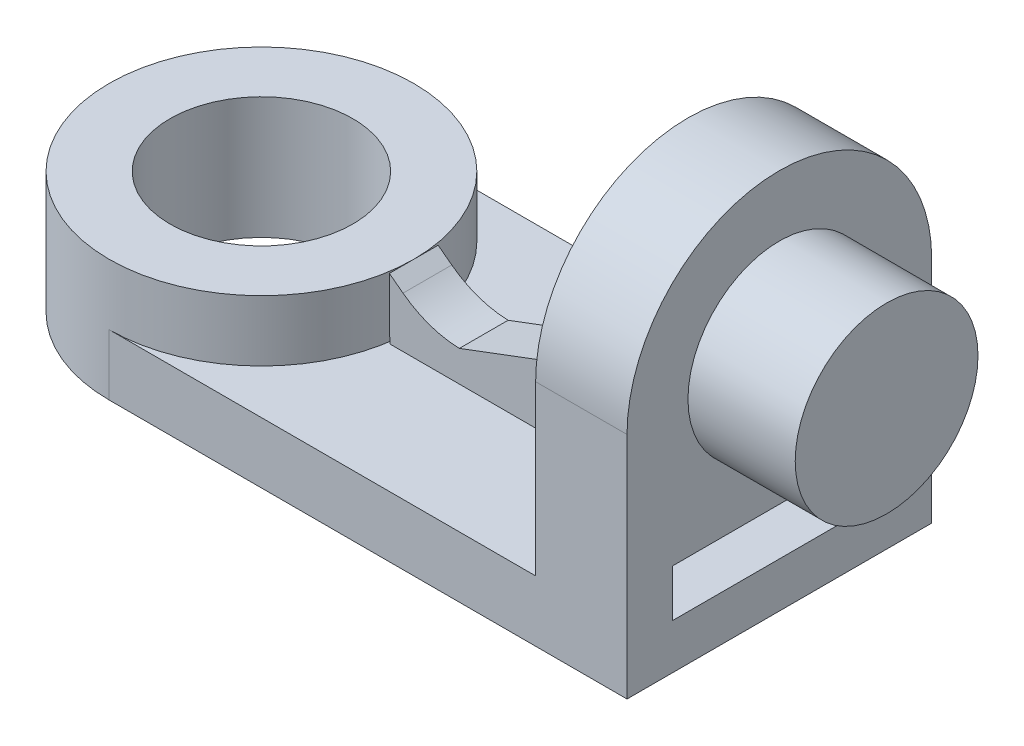
ISO-10303-21;
HEADER;
FILE_DESCRIPTION(('STEP AP214'),'2;1');
FILE_NAME('part.step','',(''),(''),'','','');
FILE_SCHEMA(('AUTOMOTIVE_DESIGN { 1 0 10303 214 1 1 1 1 }'));
ENDSEC;
DATA;
#1=APPLICATION_CONTEXT('core data for automotive mechanical design processes');
#2=APPLICATION_PROTOCOL_DEFINITION('international standard','automotive_design',2000,#1);
#3=PRODUCT_CONTEXT('',#1,'mechanical');
#4=PRODUCT('Part','Part','',(#3));
#5=PRODUCT_RELATED_PRODUCT_CATEGORY('part','',(#4));
#6=PRODUCT_DEFINITION_FORMATION('','',#4);
#7=PRODUCT_DEFINITION_CONTEXT('part definition',#1,'design');
#8=PRODUCT_DEFINITION('design','',#6,#7);
#9=PRODUCT_DEFINITION_SHAPE('','',#8);
#10=(LENGTH_UNIT() NAMED_UNIT(*) SI_UNIT(.MILLI.,.METRE.));
#11=(NAMED_UNIT(*) PLANE_ANGLE_UNIT() SI_UNIT($,.RADIAN.));
#12=(NAMED_UNIT(*) SI_UNIT($,.STERADIAN.) SOLID_ANGLE_UNIT());
#13=UNCERTAINTY_MEASURE_WITH_UNIT(LENGTH_MEASURE(1.E-05),#10,'distance_accuracy_value','');
#14=(GEOMETRIC_REPRESENTATION_CONTEXT(3) GLOBAL_UNCERTAINTY_ASSIGNED_CONTEXT((#13)) GLOBAL_UNIT_ASSIGNED_CONTEXT((#10,
#11,#12)) REPRESENTATION_CONTEXT('',''));
#15=CARTESIAN_POINT('',(0.,0.,0.));
#16=DIRECTION('',(0.,0.,1.));
#17=DIRECTION('',(1.,0.,0.));
#18=AXIS2_PLACEMENT_3D('',#15,#16,#17);
#19=CARTESIAN_POINT('',(0.,0.,13.335));
#20=DIRECTION('',(0.,0.,-1.));
#21=DIRECTION('',(-1.,0.,0.));
#22=AXIS2_PLACEMENT_3D('',#19,#20,#21);
#23=PLANE('',#22);
#24=DIRECTION('',(0.,1.,0.));
#25=VECTOR('',#24,1.);
#26=CARTESIAN_POINT('',(44.3323276109027,2.04732485996252,13.335));
#27=LINE('',#26,#25);
#28=CARTESIAN_POINT('',(44.3323276109027,2.04732485996252,13.335));
#29=VERTEX_POINT('',#28);
#30=CARTESIAN_POINT('',(44.3323276109027,17.5413248599625,13.335));
#31=VERTEX_POINT('',#30);
#32=EDGE_CURVE('E13',#29,#31,#27,.T.);
#33=ORIENTED_EDGE('',*,*,#32,.F.);
#34=DIRECTION('',(0.999929666975512,0.0118600633320941,0.));
#35=VECTOR('',#34,1.);
#36=CARTESIAN_POINT('',(15.9469883545853,1.71064925926635,13.335));
#37=LINE('',#36,#35);
#38=CARTESIAN_POINT('',(15.9469883545853,1.71064925926635,13.335));
#39=VERTEX_POINT('',#38);
#40=EDGE_CURVE('E59',#39,#29,#37,.T.);
#41=ORIENTED_EDGE('',*,*,#40,.F.);
#42=DIRECTION('',(0.00655059718679373,-0.999978544608081,0.));
#43=VECTOR('',#42,1.);
#44=CARTESIAN_POINT('',(15.875,12.7,13.335));
#45=LINE('',#44,#43);
#46=CARTESIAN_POINT('',(15.875,12.7,13.335));
#47=VERTEX_POINT('',#46);
#48=EDGE_CURVE('E137',#47,#39,#45,.T.);
#49=ORIENTED_EDGE('',*,*,#48,.F.);
#50=DIRECTION('',(-0.797948568980838,0.602725543893265,0.));
#51=VECTOR('',#50,1.);
#52=CARTESIAN_POINT('',(17.296678151654,11.6261441520081,13.335));
#53=LINE('',#52,#51);
#54=CARTESIAN_POINT('',(17.296678151654,11.6261441520081,13.335));
#55=VERTEX_POINT('',#54);
#56=EDGE_CURVE('E161',#55,#47,#53,.T.);
#57=ORIENTED_EDGE('',*,*,#56,.F.);
#58=CARTESIAN_POINT('',(23.4203696776096,19.7333016128534,13.335));
#59=DIRECTION('',(0.,0.,-1.));
#60=DIRECTION('',(-1.,0.,0.));
#61=AXIS2_PLACEMENT_3D('',#58,#59,#60);
#62=CIRCLE('',#61,10.16);
#63=CARTESIAN_POINT('',(23.1696247172813,9.576396229575,13.335));
#64=VERTEX_POINT('',#63);
#65=EDGE_CURVE('E152',#64,#55,#62,.T.);
#66=ORIENTED_EDGE('',*,*,#65,.F.);
#67=DIRECTION('',(-0.935908095158257,-0.352244286564372,0.));
#68=VECTOR('',#67,1.);
#69=CARTESIAN_POINT('',(44.3323276109027,17.5413248599625,13.335));
#70=LINE('',#69,#68);
#71=EDGE_CURVE('E100',#31,#64,#70,.T.);
#72=ORIENTED_EDGE('',*,*,#71,.F.);
#73=EDGE_LOOP('',(#33,#41,#49,#57,#66,#72));
#74=FACE_BOUND('',#73,.T.);
#75=ADVANCED_FACE('F43',(#74),#23,.T.);
#76=CARTESIAN_POINT('',(15.9469883545853,1.71064925926635,15.875));
#77=DIRECTION('',(-0.0118600633320941,0.999929666975512,0.));
#78=DIRECTION('',(-0.999929666975512,-0.0118600633320941,0.));
#79=AXIS2_PLACEMENT_3D('',#76,#77,#78);
#80=PLANE('',#79);
#81=ORIENTED_EDGE('',*,*,#40,.T.);
#82=DIRECTION('',(0.,0.,-1.));
#83=VECTOR('',#82,1.);
#84=CARTESIAN_POINT('',(44.3323276109027,2.04732485996252,15.875));
#85=LINE('',#84,#83);
#86=CARTESIAN_POINT('',(44.3323276109027,2.04732485996252,18.415));
#87=VERTEX_POINT('',#86);
#88=EDGE_CURVE('E135',#87,#29,#85,.T.);
#89=ORIENTED_EDGE('',*,*,#88,.F.);
#90=DIRECTION('',(0.999929666975512,0.0118600633320941,0.));
#91=VECTOR('',#90,1.);
#92=CARTESIAN_POINT('',(15.9469883545853,1.71064925926635,18.415));
#93=LINE('',#92,#91);
#94=CARTESIAN_POINT('',(15.9469883545853,1.71064925926635,18.415));
#95=VERTEX_POINT('',#94);
#96=EDGE_CURVE('E111',#95,#87,#93,.T.);
#97=ORIENTED_EDGE('',*,*,#96,.F.);
#98=DIRECTION('',(0.,0.,-1.));
#99=VECTOR('',#98,1.);
#100=CARTESIAN_POINT('',(15.9469883545853,1.71064925926635,15.875));
#101=LINE('',#100,#99);
#102=EDGE_CURVE('E138',#95,#39,#101,.T.);
#103=ORIENTED_EDGE('',*,*,#102,.T.);
#104=EDGE_LOOP('',(#81,#89,#97,#103));
#105=FACE_BOUND('',#104,.T.);
#106=ADVANCED_FACE('F174',(#105),#80,.F.);
#107=CARTESIAN_POINT('',(15.875,12.7,15.875));
#108=DIRECTION('',(0.999978544608081,0.00655059718679372,0.));
#109=DIRECTION('',(-0.00655059718679372,0.999978544608081,0.));
#110=AXIS2_PLACEMENT_3D('',#107,#108,#109);
#111=PLANE('',#110);
#112=ORIENTED_EDGE('',*,*,#48,.T.);
#113=ORIENTED_EDGE('',*,*,#102,.F.);
#114=DIRECTION('',(0.00655059718679373,-0.999978544608081,0.));
#115=VECTOR('',#114,1.);
#116=CARTESIAN_POINT('',(15.875,12.7,18.415));
#117=LINE('',#116,#115);
#118=CARTESIAN_POINT('',(15.875,12.7,18.415));
#119=VERTEX_POINT('',#118);
#120=EDGE_CURVE('E129',#119,#95,#117,.T.);
#121=ORIENTED_EDGE('',*,*,#120,.F.);
#122=DIRECTION('',(0.,0.,-1.));
#123=VECTOR('',#122,1.);
#124=CARTESIAN_POINT('',(15.875,12.7,15.875));
#125=LINE('',#124,#123);
#126=EDGE_CURVE('E165',#119,#47,#125,.T.);
#127=ORIENTED_EDGE('',*,*,#126,.T.);
#128=EDGE_LOOP('',(#112,#113,#121,#127));
#129=FACE_BOUND('',#128,.T.);
#130=ADVANCED_FACE('F186',(#129),#111,.F.);
#131=CARTESIAN_POINT('',(17.296678151654,11.6261441520081,15.875));
#132=DIRECTION('',(-0.602725543893265,-0.797948568980838,0.));
#133=DIRECTION('',(0.797948568980838,-0.602725543893265,0.));
#134=AXIS2_PLACEMENT_3D('',#131,#132,#133);
#135=PLANE('',#134);
#136=ORIENTED_EDGE('',*,*,#56,.T.);
#137=ORIENTED_EDGE('',*,*,#126,.F.);
#138=DIRECTION('',(-0.797948568980838,0.602725543893265,0.));
#139=VECTOR('',#138,1.);
#140=CARTESIAN_POINT('',(17.296678151654,11.6261441520081,18.415));
#141=LINE('',#140,#139);
#142=CARTESIAN_POINT('',(17.296678151654,11.6261441520081,18.415));
#143=VERTEX_POINT('',#142);
#144=EDGE_CURVE('E118',#143,#119,#141,.T.);
#145=ORIENTED_EDGE('',*,*,#144,.F.);
#146=DIRECTION('',(0.,0.,-1.));
#147=VECTOR('',#146,1.);
#148=CARTESIAN_POINT('',(17.296678151654,11.6261441520081,15.875));
#149=LINE('',#148,#147);
#150=EDGE_CURVE('E156',#143,#55,#149,.T.);
#151=ORIENTED_EDGE('',*,*,#150,.T.);
#152=EDGE_LOOP('',(#136,#137,#145,#151));
#153=FACE_BOUND('',#152,.T.);
#154=ADVANCED_FACE('F185',(#153),#135,.F.);
#155=CARTESIAN_POINT('',(23.4203696776096,19.7333016128534,15.875));
#156=DIRECTION('',(0.,0.,-1.));
#157=DIRECTION('',(-1.,0.,0.));
#158=AXIS2_PLACEMENT_3D('',#155,#156,#157);
#159=CYLINDRICAL_SURFACE('',#158,10.16);
#160=ORIENTED_EDGE('',*,*,#65,.T.);
#161=ORIENTED_EDGE('',*,*,#150,.F.);
#162=CARTESIAN_POINT('',(23.4203696776096,19.7333016128534,18.415));
#163=DIRECTION('',(0.,0.,-1.));
#164=DIRECTION('',(-1.,0.,0.));
#165=AXIS2_PLACEMENT_3D('',#162,#163,#164);
#166=CIRCLE('',#165,10.16);
#167=CARTESIAN_POINT('',(23.1696247172813,9.576396229575,18.415));
#168=VERTEX_POINT('',#167);
#169=EDGE_CURVE('E116',#168,#143,#166,.T.);
#170=ORIENTED_EDGE('',*,*,#169,.F.);
#171=DIRECTION('',(0.,0.,-1.));
#172=VECTOR('',#171,1.);
#173=CARTESIAN_POINT('',(23.1696247172813,9.576396229575,15.875));
#174=LINE('',#173,#172);
#175=EDGE_CURVE('E115',#168,#64,#174,.T.);
#176=ORIENTED_EDGE('',*,*,#175,.T.);
#177=EDGE_LOOP('',(#160,#161,#170,#176));
#178=FACE_BOUND('',#177,.T.);
#179=ADVANCED_FACE('F182',(#178),#159,.F.);
#180=CARTESIAN_POINT('',(44.3323276109027,17.5413248599625,15.875));
#181=DIRECTION('',(0.352244286564372,-0.935908095158257,0.));
#182=DIRECTION('',(0.935908095158257,0.352244286564372,0.));
#183=AXIS2_PLACEMENT_3D('',#180,#181,#182);
#184=PLANE('',#183);
#185=ORIENTED_EDGE('',*,*,#71,.T.);
#186=ORIENTED_EDGE('',*,*,#175,.F.);
#187=DIRECTION('',(-0.935908095158257,-0.352244286564372,0.));
#188=VECTOR('',#187,1.);
#189=CARTESIAN_POINT('',(44.3323276109027,17.5413248599625,18.415));
#190=LINE('',#189,#188);
#191=CARTESIAN_POINT('',(44.3323276109027,17.5413248599625,18.415));
#192=VERTEX_POINT('',#191);
#193=EDGE_CURVE('E107',#192,#168,#190,.T.);
#194=ORIENTED_EDGE('',*,*,#193,.F.);
#195=DIRECTION('',(0.,0.,-1.));
#196=VECTOR('',#195,1.);
#197=CARTESIAN_POINT('',(44.3323276109027,17.5413248599625,15.875));
#198=LINE('',#197,#196);
#199=EDGE_CURVE('E52',#192,#31,#198,.T.);
#200=ORIENTED_EDGE('',*,*,#199,.T.);
#201=EDGE_LOOP('',(#185,#186,#194,#200));
#202=FACE_BOUND('',#201,.T.);
#203=ADVANCED_FACE('F113',(#202),#184,.F.);
#204=CARTESIAN_POINT('',(44.3323276109027,2.04732485996252,15.875));
#205=DIRECTION('',(-1.,0.,0.));
#206=DIRECTION('',(0.,0.,1.));
#207=AXIS2_PLACEMENT_3D('',#204,#205,#206);
#208=PLANE('',#207);
#209=ORIENTED_EDGE('',*,*,#32,.T.);
#210=ORIENTED_EDGE('',*,*,#199,.F.);
#211=DIRECTION('',(0.,1.,0.));
#212=VECTOR('',#211,1.);
#213=CARTESIAN_POINT('',(44.3323276109027,2.04732485996252,18.415));
#214=LINE('',#213,#212);
#215=EDGE_CURVE('E95',#87,#192,#214,.T.);
#216=ORIENTED_EDGE('',*,*,#215,.F.);
#217=ORIENTED_EDGE('',*,*,#88,.T.);
#218=EDGE_LOOP('',(#209,#210,#216,#217));
#219=FACE_BOUND('',#218,.T.);
#220=ADVANCED_FACE('F94',(#219),#208,.F.);
#221=CARTESIAN_POINT('',(0.,0.,18.415));
#222=DIRECTION('',(0.,0.,-1.));
#223=DIRECTION('',(-1.,0.,0.));
#224=AXIS2_PLACEMENT_3D('',#221,#222,#223);
#225=PLANE('',#224);
#226=ORIENTED_EDGE('',*,*,#215,.T.);
#227=ORIENTED_EDGE('',*,*,#193,.T.);
#228=ORIENTED_EDGE('',*,*,#169,.T.);
#229=ORIENTED_EDGE('',*,*,#144,.T.);
#230=ORIENTED_EDGE('',*,*,#120,.T.);
#231=ORIENTED_EDGE('',*,*,#96,.T.);
#232=EDGE_LOOP('',(#226,#227,#228,#229,#230,#231));
#233=FACE_BOUND('',#232,.T.);
#234=ADVANCED_FACE('F105',(#233),#225,.F.);
#235=CLOSED_SHELL('',(#75,#106,#130,#154,#179,#203,#220,#234));
#236=MANIFOLD_SOLID_BREP('B2',#235);
#237=CARTESIAN_POINT('',(0.,6.35,0.));
#238=DIRECTION('',(0.,1.,0.));
#239=DIRECTION('',(0.,0.,1.));
#240=AXIS2_PLACEMENT_3D('',#237,#238,#239);
#241=PLANE('',#240);
#242=DIRECTION('',(1.,0.,0.));
#243=VECTOR('',#242,1.);
#244=CARTESIAN_POINT('',(0.,6.35,31.75));
#245=LINE('',#244,#243);
#246=CARTESIAN_POINT('',(0.,6.35,31.75));
#247=VERTEX_POINT('',#246);
#248=CARTESIAN_POINT('',(44.45,6.35,31.75));
#249=VERTEX_POINT('',#248);
#250=EDGE_CURVE('E278',#247,#249,#245,.T.);
#251=ORIENTED_EDGE('',*,*,#250,.T.);
#252=DIRECTION('',(0.,0.,1.));
#253=VECTOR('',#252,1.);
#254=CARTESIAN_POINT('',(44.45,6.35,0.));
#255=LINE('',#254,#253);
#256=CARTESIAN_POINT('',(44.45,6.35,0.));
#257=VERTEX_POINT('',#256);
#258=EDGE_CURVE('E378',#257,#249,#255,.T.);
#259=ORIENTED_EDGE('',*,*,#258,.F.);
#260=DIRECTION('',(-1.,0.,0.));
#261=VECTOR('',#260,1.);
#262=CARTESIAN_POINT('',(0.,6.35,0.));
#263=LINE('',#262,#261);
#264=CARTESIAN_POINT('',(0.,6.35,0.));
#265=VERTEX_POINT('',#264);
#266=EDGE_CURVE('E409',#257,#265,#263,.T.);
#267=ORIENTED_EDGE('',*,*,#266,.T.);
#268=CARTESIAN_POINT('',(0.,6.35,15.875));
#269=DIRECTION('',(0.,1.,0.));
#270=DIRECTION('',(0.,0.,1.));
#271=AXIS2_PLACEMENT_3D('',#268,#269,#270);
#272=CIRCLE('',#271,15.875);
#273=EDGE_CURVE('E404',#265,#247,#272,.F.);
#274=ORIENTED_EDGE('',*,*,#273,.T.);
#275=EDGE_LOOP('',(#251,#259,#267,#274));
#276=FACE_BOUND('',#275,.T.);
#277=ADVANCED_FACE('F255',(#276),#241,.T.);
#278=CARTESIAN_POINT('',(0.,6.35,31.75));
#279=DIRECTION('',(0.,0.,-1.));
#280=DIRECTION('',(-1.,0.,0.));
#281=AXIS2_PLACEMENT_3D('',#278,#279,#280);
#282=PLANE('',#281);
#283=DIRECTION('',(1.,0.,0.));
#284=VECTOR('',#283,1.);
#285=CARTESIAN_POINT('',(0.,0.,31.75));
#286=LINE('',#285,#284);
#287=CARTESIAN_POINT('',(0.,0.,31.75));
#288=VERTEX_POINT('',#287);
#289=CARTESIAN_POINT('',(53.975,0.,31.75));
#290=VERTEX_POINT('',#289);
#291=EDGE_CURVE('E407',#288,#290,#286,.T.);
#292=ORIENTED_EDGE('',*,*,#291,.T.);
#293=DIRECTION('',(0.,-1.,0.));
#294=VECTOR('',#293,1.);
#295=CARTESIAN_POINT('',(53.975,6.35,31.75));
#296=LINE('',#295,#294);
#297=CARTESIAN_POINT('',(53.975,23.876,31.75));
#298=VERTEX_POINT('',#297);
#299=EDGE_CURVE('E422',#298,#290,#296,.T.);
#300=ORIENTED_EDGE('',*,*,#299,.F.);
#301=DIRECTION('',(1.,0.,0.));
#302=VECTOR('',#301,1.);
#303=CARTESIAN_POINT('',(53.975,23.876,31.75));
#304=LINE('',#303,#302);
#305=CARTESIAN_POINT('',(44.45,23.876,31.75));
#306=VERTEX_POINT('',#305);
#307=EDGE_CURVE('E384',#306,#298,#304,.T.);
#308=ORIENTED_EDGE('',*,*,#307,.F.);
#309=DIRECTION('',(0.,-1.,0.));
#310=VECTOR('',#309,1.);
#311=CARTESIAN_POINT('',(44.45,23.876,31.75));
#312=LINE('',#311,#310);
#313=EDGE_CURVE('E387',#306,#249,#312,.T.);
#314=ORIENTED_EDGE('',*,*,#313,.T.);
#315=ORIENTED_EDGE('',*,*,#250,.F.);
#316=DIRECTION('',(0.,-1.,0.));
#317=VECTOR('',#316,1.);
#318=CARTESIAN_POINT('',(0.,6.35,31.75));
#319=LINE('',#318,#317);
#320=EDGE_CURVE('E263',#247,#288,#319,.T.);
#321=ORIENTED_EDGE('',*,*,#320,.T.);
#322=EDGE_LOOP('',(#292,#300,#308,#314,#315,#321));
#323=FACE_BOUND('',#322,.T.);
#324=ADVANCED_FACE('F257',(#323),#282,.F.);
#325=CARTESIAN_POINT('',(53.975,6.35,0.));
#326=DIRECTION('',(-1.,0.,0.));
#327=DIRECTION('',(0.,0.,1.));
#328=AXIS2_PLACEMENT_3D('',#325,#326,#327);
#329=PLANE('',#328);
#330=DIRECTION('',(0.,0.,1.));
#331=VECTOR('',#330,1.);
#332=CARTESIAN_POINT('',(53.975,9.64083526091167,26.9950163601169));
#333=LINE('',#332,#331);
#334=CARTESIAN_POINT('',(53.975,9.64083526091167,4.75498363988305));
#335=VERTEX_POINT('',#334);
#336=CARTESIAN_POINT('',(53.975,9.64083526091167,26.9950163601169));
#337=VERTEX_POINT('',#336);
#338=EDGE_CURVE('E362',#335,#337,#333,.T.);
#339=ORIENTED_EDGE('',*,*,#338,.F.);
#340=DIRECTION('',(0.,1.,0.));
#341=VECTOR('',#340,1.);
#342=CARTESIAN_POINT('',(53.975,4.71016473908832,4.75498363988305));
#343=LINE('',#342,#341);
#344=CARTESIAN_POINT('',(53.975,4.71016473908832,4.75498363988305));
#345=VERTEX_POINT('',#344);
#346=EDGE_CURVE('E270',#345,#335,#343,.T.);
#347=ORIENTED_EDGE('',*,*,#346,.F.);
#348=DIRECTION('',(0.,0.,-1.));
#349=VECTOR('',#348,1.);
#350=CARTESIAN_POINT('',(53.975,4.71016473908832,26.9950163601169));
#351=LINE('',#350,#349);
#352=CARTESIAN_POINT('',(53.975,4.71016473908832,26.9950163601169));
#353=VERTEX_POINT('',#352);
#354=EDGE_CURVE('E353',#353,#345,#351,.T.);
#355=ORIENTED_EDGE('',*,*,#354,.F.);
#356=DIRECTION('',(0.,-1.,0.));
#357=VECTOR('',#356,1.);
#358=CARTESIAN_POINT('',(53.975,4.71016473908832,26.9950163601169));
#359=LINE('',#358,#357);
#360=EDGE_CURVE('E356',#337,#353,#359,.T.);
#361=ORIENTED_EDGE('',*,*,#360,.F.);
#362=EDGE_LOOP('',(#339,#347,#355,#361));
#363=FACE_BOUND('',#362,.T.);
#364=CARTESIAN_POINT('',(53.975,23.876,15.875));
#365=DIRECTION('',(-1.,0.,0.));
#366=DIRECTION('',(0.,0.,1.));
#367=AXIS2_PLACEMENT_3D('',#364,#365,#366);
#368=CIRCLE('',#367,9.525);
#369=CARTESIAN_POINT('',(53.975,23.876,25.4));
#370=VERTEX_POINT('',#369);
#371=EDGE_CURVE('E41',#370,#370,#368,.F.);
#372=ORIENTED_EDGE('',*,*,#371,.F.);
#373=EDGE_LOOP('',(#372));
#374=FACE_BOUND('',#373,.T.);
#375=DIRECTION('',(0.,-1.,0.));
#376=VECTOR('',#375,1.);
#377=CARTESIAN_POINT('',(53.975,6.35,0.));
#378=LINE('',#377,#376);
#379=CARTESIAN_POINT('',(53.975,23.876,0.));
#380=VERTEX_POINT('',#379);
#381=CARTESIAN_POINT('',(53.975,0.,0.));
#382=VERTEX_POINT('',#381);
#383=EDGE_CURVE('E419',#380,#382,#378,.T.);
#384=ORIENTED_EDGE('',*,*,#383,.F.);
#385=CARTESIAN_POINT('',(53.975,23.876,15.875));
#386=DIRECTION('',(1.,0.,0.));
#387=DIRECTION('',(0.,0.,-1.));
#388=AXIS2_PLACEMENT_3D('',#385,#386,#387);
#389=CIRCLE('',#388,15.875);
#390=EDGE_CURVE('E374',#380,#298,#389,.T.);
#391=ORIENTED_EDGE('',*,*,#390,.T.);
#392=ORIENTED_EDGE('',*,*,#299,.T.);
#393=DIRECTION('',(0.,0.,-1.));
#394=VECTOR('',#393,1.);
#395=CARTESIAN_POINT('',(53.975,0.,0.));
#396=LINE('',#395,#394);
#397=EDGE_CURVE('E414',#290,#382,#396,.T.);
#398=ORIENTED_EDGE('',*,*,#397,.T.);
#399=EDGE_LOOP('',(#384,#391,#392,#398));
#400=FACE_BOUND('',#399,.T.);
#401=ADVANCED_FACE('F445',(#363,#374,#400),#329,.F.);
#402=CARTESIAN_POINT('',(0.,6.35,0.));
#403=DIRECTION('',(0.,0.,1.));
#404=DIRECTION('',(1.,0.,0.));
#405=AXIS2_PLACEMENT_3D('',#402,#403,#404);
#406=PLANE('',#405);
#407=DIRECTION('',(-1.,0.,0.));
#408=VECTOR('',#407,1.);
#409=CARTESIAN_POINT('',(0.,0.,0.));
#410=LINE('',#409,#408);
#411=CARTESIAN_POINT('',(0.,0.,0.));
#412=VERTEX_POINT('',#411);
#413=EDGE_CURVE('E410',#382,#412,#410,.T.);
#414=ORIENTED_EDGE('',*,*,#413,.T.);
#415=DIRECTION('',(0.,-1.,0.));
#416=VECTOR('',#415,1.);
#417=CARTESIAN_POINT('',(0.,6.35,0.));
#418=LINE('',#417,#416);
#419=EDGE_CURVE('E412',#265,#412,#418,.T.);
#420=ORIENTED_EDGE('',*,*,#419,.F.);
#421=ORIENTED_EDGE('',*,*,#266,.F.);
#422=DIRECTION('',(0.,-1.,0.));
#423=VECTOR('',#422,1.);
#424=CARTESIAN_POINT('',(44.45,23.876,0.));
#425=LINE('',#424,#423);
#426=CARTESIAN_POINT('',(44.45,23.876,0.));
#427=VERTEX_POINT('',#426);
#428=EDGE_CURVE('E391',#427,#257,#425,.T.);
#429=ORIENTED_EDGE('',*,*,#428,.F.);
#430=DIRECTION('',(-1.,0.,0.));
#431=VECTOR('',#430,1.);
#432=CARTESIAN_POINT('',(53.975,23.876,0.));
#433=LINE('',#432,#431);
#434=EDGE_CURVE('E381',#380,#427,#433,.T.);
#435=ORIENTED_EDGE('',*,*,#434,.F.);
#436=ORIENTED_EDGE('',*,*,#383,.T.);
#437=EDGE_LOOP('',(#414,#420,#421,#429,#435,#436));
#438=FACE_BOUND('',#437,.T.);
#439=ADVANCED_FACE('F434',(#438),#406,.F.);
#440=CARTESIAN_POINT('',(0.,0.,0.));
#441=DIRECTION('',(0.,1.,0.));
#442=DIRECTION('',(0.,0.,1.));
#443=AXIS2_PLACEMENT_3D('',#440,#441,#442);
#444=PLANE('',#443);
#445=CARTESIAN_POINT('',(0.,0.,15.875));
#446=DIRECTION('',(0.,1.,0.));
#447=DIRECTION('',(0.,0.,1.));
#448=AXIS2_PLACEMENT_3D('',#445,#446,#447);
#449=CIRCLE('',#448,9.525);
#450=CARTESIAN_POINT('',(0.,0.,25.4));
#451=VERTEX_POINT('',#450);
#452=EDGE_CURVE('E395',#451,#451,#449,.T.);
#453=ORIENTED_EDGE('',*,*,#452,.T.);
#454=EDGE_LOOP('',(#453));
#455=FACE_BOUND('',#454,.T.);
#456=ORIENTED_EDGE('',*,*,#291,.F.);
#457=CARTESIAN_POINT('',(0.,0.,15.875));
#458=DIRECTION('',(0.,1.,0.));
#459=DIRECTION('',(0.,0.,1.));
#460=AXIS2_PLACEMENT_3D('',#457,#458,#459);
#461=CIRCLE('',#460,15.875);
#462=EDGE_CURVE('E398',#412,#288,#461,.T.);
#463=ORIENTED_EDGE('',*,*,#462,.F.);
#464=ORIENTED_EDGE('',*,*,#413,.F.);
#465=ORIENTED_EDGE('',*,*,#397,.F.);
#466=EDGE_LOOP('',(#456,#463,#464,#465));
#467=FACE_BOUND('',#466,.T.);
#468=ADVANCED_FACE('F448',(#455,#467),#444,.F.);
#469=CARTESIAN_POINT('',(0.,12.7,15.875));
#470=DIRECTION('',(0.,-1.,0.));
#471=DIRECTION('',(0.,0.,-1.));
#472=AXIS2_PLACEMENT_3D('',#469,#470,#471);
#473=CYLINDRICAL_SURFACE('',#472,15.875);
#474=CARTESIAN_POINT('',(0.,12.7,15.875));
#475=DIRECTION('',(0.,1.,0.));
#476=DIRECTION('',(0.,0.,1.));
#477=AXIS2_PLACEMENT_3D('',#474,#475,#476);
#478=CIRCLE('',#477,15.875);
#479=CARTESIAN_POINT('',(0.,12.7,31.75));
#480=VERTEX_POINT('',#479);
#481=EDGE_CURVE('E401',#480,#480,#478,.T.);
#482=ORIENTED_EDGE('',*,*,#481,.F.);
#483=EDGE_LOOP('',(#482));
#484=FACE_BOUND('',#483,.T.);
#485=ORIENTED_EDGE('',*,*,#462,.T.);
#486=ORIENTED_EDGE('',*,*,#320,.F.);
#487=ORIENTED_EDGE('',*,*,#273,.F.);
#488=ORIENTED_EDGE('',*,*,#419,.T.);
#489=EDGE_LOOP('',(#485,#486,#487,#488));
#490=FACE_BOUND('',#489,.T.);
#491=ADVANCED_FACE('F429',(#484,#490),#473,.T.);
#492=CARTESIAN_POINT('',(0.,12.7,15.875));
#493=DIRECTION('',(0.,1.,0.));
#494=DIRECTION('',(0.,0.,1.));
#495=AXIS2_PLACEMENT_3D('',#492,#493,#494);
#496=PLANE('',#495);
#497=CARTESIAN_POINT('',(0.,12.7,15.875));
#498=DIRECTION('',(0.,1.,0.));
#499=DIRECTION('',(0.,0.,1.));
#500=AXIS2_PLACEMENT_3D('',#497,#498,#499);
#501=CIRCLE('',#500,9.525);
#502=CARTESIAN_POINT('',(0.,12.7,25.4));
#503=VERTEX_POINT('',#502);
#504=EDGE_CURVE('E394',#503,#503,#501,.T.);
#505=ORIENTED_EDGE('',*,*,#504,.F.);
#506=EDGE_LOOP('',(#505));
#507=FACE_BOUND('',#506,.T.);
#508=ORIENTED_EDGE('',*,*,#481,.T.);
#509=EDGE_LOOP('',(#508));
#510=FACE_BOUND('',#509,.T.);
#511=ADVANCED_FACE('F456',(#507,#510),#496,.T.);
#512=CARTESIAN_POINT('',(0.,0.,15.875));
#513=DIRECTION('',(0.,1.,0.));
#514=DIRECTION('',(0.,0.,1.));
#515=AXIS2_PLACEMENT_3D('',#512,#513,#514);
#516=CYLINDRICAL_SURFACE('',#515,9.525);
#517=ORIENTED_EDGE('',*,*,#452,.F.);
#518=EDGE_LOOP('',(#517));
#519=FACE_BOUND('',#518,.T.);
#520=ORIENTED_EDGE('',*,*,#504,.T.);
#521=EDGE_LOOP('',(#520));
#522=FACE_BOUND('',#521,.T.);
#523=ADVANCED_FACE('F470',(#519,#522),#516,.F.);
#524=CARTESIAN_POINT('',(44.45,23.876,0.));
#525=DIRECTION('',(1.,0.,0.));
#526=DIRECTION('',(0.,0.,-1.));
#527=AXIS2_PLACEMENT_3D('',#524,#525,#526);
#528=PLANE('',#527);
#529=ORIENTED_EDGE('',*,*,#313,.F.);
#530=CARTESIAN_POINT('',(44.45,23.876,15.875));
#531=DIRECTION('',(1.,0.,0.));
#532=DIRECTION('',(0.,0.,-1.));
#533=AXIS2_PLACEMENT_3D('',#530,#531,#532);
#534=CIRCLE('',#533,15.875);
#535=EDGE_CURVE('E375',#427,#306,#534,.T.);
#536=ORIENTED_EDGE('',*,*,#535,.F.);
#537=ORIENTED_EDGE('',*,*,#428,.T.);
#538=ORIENTED_EDGE('',*,*,#258,.T.);
#539=EDGE_LOOP('',(#529,#536,#537,#538));
#540=FACE_BOUND('',#539,.T.);
#541=ADVANCED_FACE('F437',(#540),#528,.F.);
#542=CARTESIAN_POINT('',(44.45,23.876,15.875));
#543=DIRECTION('',(1.,0.,0.));
#544=DIRECTION('',(0.,0.,-1.));
#545=AXIS2_PLACEMENT_3D('',#542,#543,#544);
#546=CYLINDRICAL_SURFACE('',#545,15.875);
#547=ORIENTED_EDGE('',*,*,#434,.T.);
#548=ORIENTED_EDGE('',*,*,#535,.T.);
#549=ORIENTED_EDGE('',*,*,#307,.T.);
#550=ORIENTED_EDGE('',*,*,#390,.F.);
#551=EDGE_LOOP('',(#547,#548,#549,#550));
#552=FACE_BOUND('',#551,.T.);
#553=ADVANCED_FACE('F440',(#552),#546,.T.);
#554=CARTESIAN_POINT('',(65.151,23.876,15.875));
#555=DIRECTION('',(-1.,0.,0.));
#556=DIRECTION('',(0.,0.,1.));
#557=AXIS2_PLACEMENT_3D('',#554,#555,#556);
#558=CYLINDRICAL_SURFACE('',#557,9.525);
#559=CARTESIAN_POINT('',(65.151,23.876,15.875));
#560=DIRECTION('',(1.,0.,0.));
#561=DIRECTION('',(0.,0.,-1.));
#562=AXIS2_PLACEMENT_3D('',#559,#560,#561);
#563=CIRCLE('',#562,9.525);
#564=CARTESIAN_POINT('',(65.151,23.876,6.35));
#565=VERTEX_POINT('',#564);
#566=EDGE_CURVE('E368',#565,#565,#563,.T.);
#567=ORIENTED_EDGE('',*,*,#566,.F.);
#568=EDGE_LOOP('',(#567));
#569=FACE_BOUND('',#568,.T.);
#570=ORIENTED_EDGE('',*,*,#371,.T.);
#571=EDGE_LOOP('',(#570));
#572=FACE_BOUND('',#571,.T.);
#573=ADVANCED_FACE('F479',(#569,#572),#558,.T.);
#574=CARTESIAN_POINT('',(65.151,23.876,15.875));
#575=DIRECTION('',(1.,0.,0.));
#576=DIRECTION('',(0.,0.,-1.));
#577=AXIS2_PLACEMENT_3D('',#574,#575,#576);
#578=PLANE('',#577);
#579=ORIENTED_EDGE('',*,*,#566,.T.);
#580=EDGE_LOOP('',(#579));
#581=FACE_BOUND('',#580,.T.);
#582=ADVANCED_FACE('F482',(#581),#578,.T.);
#583=CARTESIAN_POINT('',(46.355,4.71016473908832,4.75498363988306));
#584=DIRECTION('',(0.,0.,-1.));
#585=DIRECTION('',(-1.,0.,0.));
#586=AXIS2_PLACEMENT_3D('',#583,#584,#585);
#587=PLANE('',#586);
#588=ORIENTED_EDGE('',*,*,#346,.T.);
#589=DIRECTION('',(1.,0.,0.));
#590=VECTOR('',#589,1.);
#591=CARTESIAN_POINT('',(46.355,9.64083526091167,4.75498363988306));
#592=LINE('',#591,#590);
#593=CARTESIAN_POINT('',(46.355,9.64083526091167,4.75498363988306));
#594=VERTEX_POINT('',#593);
#595=EDGE_CURVE('E331',#594,#335,#592,.T.);
#596=ORIENTED_EDGE('',*,*,#595,.F.);
#597=DIRECTION('',(0.,1.,0.));
#598=VECTOR('',#597,1.);
#599=CARTESIAN_POINT('',(46.355,4.71016473908832,4.75498363988306));
#600=LINE('',#599,#598);
#601=CARTESIAN_POINT('',(46.355,4.71016473908832,4.75498363988306));
#602=VERTEX_POINT('',#601);
#603=EDGE_CURVE('E335',#602,#594,#600,.T.);
#604=ORIENTED_EDGE('',*,*,#603,.F.);
#605=DIRECTION('',(1.,0.,0.));
#606=VECTOR('',#605,1.);
#607=CARTESIAN_POINT('',(46.355,4.71016473908832,4.75498363988306));
#608=LINE('',#607,#606);
#609=EDGE_CURVE('E366',#602,#345,#608,.T.);
#610=ORIENTED_EDGE('',*,*,#609,.T.);
#611=EDGE_LOOP('',(#588,#596,#604,#610));
#612=FACE_BOUND('',#611,.T.);
#613=ADVANCED_FACE('F333',(#612),#587,.F.);
#614=CARTESIAN_POINT('',(46.355,4.71016473908832,26.9950163601169));
#615=DIRECTION('',(0.,-1.,0.));
#616=DIRECTION('',(0.,0.,-1.));
#617=AXIS2_PLACEMENT_3D('',#614,#615,#616);
#618=PLANE('',#617);
#619=ORIENTED_EDGE('',*,*,#354,.T.);
#620=ORIENTED_EDGE('',*,*,#609,.F.);
#621=DIRECTION('',(0.,0.,-1.));
#622=VECTOR('',#621,1.);
#623=CARTESIAN_POINT('',(46.355,4.71016473908832,26.9950163601169));
#624=LINE('',#623,#622);
#625=CARTESIAN_POINT('',(46.355,4.71016473908832,26.9950163601169));
#626=VERTEX_POINT('',#625);
#627=EDGE_CURVE('E341',#626,#602,#624,.T.);
#628=ORIENTED_EDGE('',*,*,#627,.F.);
#629=DIRECTION('',(1.,0.,0.));
#630=VECTOR('',#629,1.);
#631=CARTESIAN_POINT('',(46.355,4.71016473908832,26.9950163601169));
#632=LINE('',#631,#630);
#633=EDGE_CURVE('E369',#626,#353,#632,.T.);
#634=ORIENTED_EDGE('',*,*,#633,.T.);
#635=EDGE_LOOP('',(#619,#620,#628,#634));
#636=FACE_BOUND('',#635,.T.);
#637=ADVANCED_FACE('F489',(#636),#618,.F.);
#638=CARTESIAN_POINT('',(46.355,4.71016473908832,26.9950163601169));
#639=DIRECTION('',(0.,0.,1.));
#640=DIRECTION('',(1.,0.,0.));
#641=AXIS2_PLACEMENT_3D('',#638,#639,#640);
#642=PLANE('',#641);
#643=ORIENTED_EDGE('',*,*,#360,.T.);
#644=ORIENTED_EDGE('',*,*,#633,.F.);
#645=DIRECTION('',(0.,-1.,0.));
#646=VECTOR('',#645,1.);
#647=CARTESIAN_POINT('',(46.355,4.71016473908832,26.9950163601169));
#648=LINE('',#647,#646);
#649=CARTESIAN_POINT('',(46.355,9.64083526091167,26.9950163601169));
#650=VERTEX_POINT('',#649);
#651=EDGE_CURVE('E349',#650,#626,#648,.T.);
#652=ORIENTED_EDGE('',*,*,#651,.F.);
#653=DIRECTION('',(1.,0.,0.));
#654=VECTOR('',#653,1.);
#655=CARTESIAN_POINT('',(46.355,9.64083526091167,26.9950163601169));
#656=LINE('',#655,#654);
#657=EDGE_CURVE('E340',#650,#337,#656,.T.);
#658=ORIENTED_EDGE('',*,*,#657,.T.);
#659=EDGE_LOOP('',(#643,#644,#652,#658));
#660=FACE_BOUND('',#659,.T.);
#661=ADVANCED_FACE('F492',(#660),#642,.F.);
#662=CARTESIAN_POINT('',(46.355,9.64083526091167,26.9950163601169));
#663=DIRECTION('',(0.,1.,0.));
#664=DIRECTION('',(0.,0.,1.));
#665=AXIS2_PLACEMENT_3D('',#662,#663,#664);
#666=PLANE('',#665);
#667=ORIENTED_EDGE('',*,*,#338,.T.);
#668=ORIENTED_EDGE('',*,*,#657,.F.);
#669=DIRECTION('',(0.,0.,1.));
#670=VECTOR('',#669,1.);
#671=CARTESIAN_POINT('',(46.355,9.64083526091167,26.9950163601169));
#672=LINE('',#671,#670);
#673=EDGE_CURVE('E344',#594,#650,#672,.T.);
#674=ORIENTED_EDGE('',*,*,#673,.F.);
#675=ORIENTED_EDGE('',*,*,#595,.T.);
#676=EDGE_LOOP('',(#667,#668,#674,#675));
#677=FACE_BOUND('',#676,.T.);
#678=ADVANCED_FACE('F345',(#677),#666,.F.);
#679=CARTESIAN_POINT('',(46.355,0.,0.));
#680=DIRECTION('',(-1.,0.,0.));
#681=DIRECTION('',(0.,0.,1.));
#682=AXIS2_PLACEMENT_3D('',#679,#680,#681);
#683=PLANE('',#682);
#684=ORIENTED_EDGE('',*,*,#603,.T.);
#685=ORIENTED_EDGE('',*,*,#673,.T.);
#686=ORIENTED_EDGE('',*,*,#651,.T.);
#687=ORIENTED_EDGE('',*,*,#627,.T.);
#688=EDGE_LOOP('',(#684,#685,#686,#687));
#689=FACE_BOUND('',#688,.T.);
#690=ADVANCED_FACE('F351',(#689),#683,.F.);
#691=CLOSED_SHELL('',(#277,#324,#401,#439,#468,#491,#511,#523,#541,#553,#573,#582,#613,#637,
#661,#678,#690));
#692=MANIFOLD_SOLID_BREP('B7',#691);
#693=ADVANCED_BREP_SHAPE_REPRESENTATION('',(#18,#236,#692),#14);
#694=SHAPE_DEFINITION_REPRESENTATION(#9,#693);
ENDSEC;
END-ISO-10303-21;
